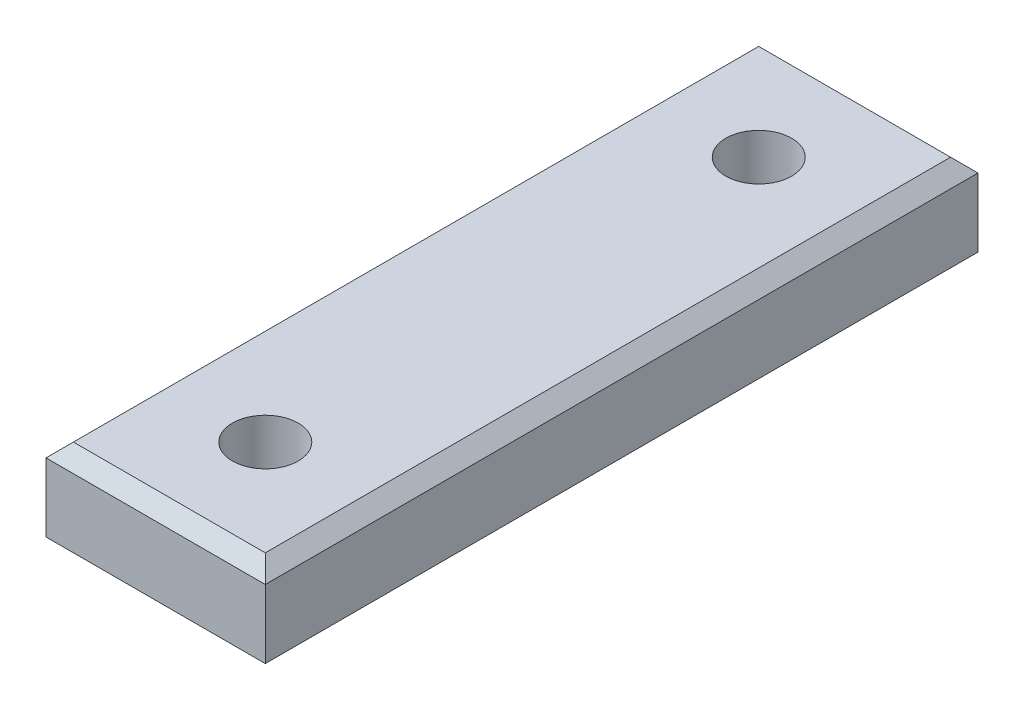
ISO-10303-21;
HEADER;
FILE_DESCRIPTION(('STEP AP214'),'2;1');
FILE_NAME('part.step','',(''),(''),'','','');
FILE_SCHEMA(('AUTOMOTIVE_DESIGN { 1 0 10303 214 1 1 1 1 }'));
ENDSEC;
DATA;
#1=APPLICATION_CONTEXT('core data for automotive mechanical design processes');
#2=APPLICATION_PROTOCOL_DEFINITION('international standard','automotive_design',2000,#1);
#3=PRODUCT_CONTEXT('',#1,'mechanical');
#4=PRODUCT('Part','Part','',(#3));
#5=PRODUCT_RELATED_PRODUCT_CATEGORY('part','',(#4));
#6=PRODUCT_DEFINITION_FORMATION('','',#4);
#7=PRODUCT_DEFINITION_CONTEXT('part definition',#1,'design');
#8=PRODUCT_DEFINITION('design','',#6,#7);
#9=PRODUCT_DEFINITION_SHAPE('','',#8);
#10=(LENGTH_UNIT() NAMED_UNIT(*) SI_UNIT(.MILLI.,.METRE.));
#11=(NAMED_UNIT(*) PLANE_ANGLE_UNIT() SI_UNIT($,.RADIAN.));
#12=(NAMED_UNIT(*) SI_UNIT($,.STERADIAN.) SOLID_ANGLE_UNIT());
#13=UNCERTAINTY_MEASURE_WITH_UNIT(LENGTH_MEASURE(1.E-05),#10,'distance_accuracy_value','');
#14=(GEOMETRIC_REPRESENTATION_CONTEXT(3) GLOBAL_UNCERTAINTY_ASSIGNED_CONTEXT((#13)) GLOBAL_UNIT_ASSIGNED_CONTEXT((#10,
#11,#12)) REPRESENTATION_CONTEXT('',''));
#15=CARTESIAN_POINT('',(0.,0.,0.));
#16=DIRECTION('',(0.,0.,1.));
#17=DIRECTION('',(1.,0.,0.));
#18=AXIS2_PLACEMENT_3D('',#15,#16,#17);
#19=CARTESIAN_POINT('',(4.,1.75,5.));
#20=DIRECTION('',(-1.,0.,0.));
#21=DIRECTION('',(0.,0.,1.));
#22=AXIS2_PLACEMENT_3D('',#19,#20,#21);
#23=PLANE('',#22);
#24=DIRECTION('',(0.,-1.,0.));
#25=VECTOR('',#24,1.);
#26=CARTESIAN_POINT('',(4.,1.75,-13.));
#27=LINE('',#26,#25);
#28=CARTESIAN_POINT('',(4.,1.25,-13.));
#29=VERTEX_POINT('',#28);
#30=CARTESIAN_POINT('',(4.,-1.25,-13.));
#31=VERTEX_POINT('',#30);
#32=EDGE_CURVE('E136',#29,#31,#27,.T.);
#33=ORIENTED_EDGE('',*,*,#32,.F.);
#34=DIRECTION('',(0.,0.,1.));
#35=VECTOR('',#34,1.);
#36=CARTESIAN_POINT('',(4.,1.25,5.));
#37=LINE('',#36,#35);
#38=CARTESIAN_POINT('',(4.,1.25,13.));
#39=VERTEX_POINT('',#38);
#40=EDGE_CURVE('E170',#29,#39,#37,.T.);
#41=ORIENTED_EDGE('',*,*,#40,.T.);
#42=DIRECTION('',(0.,-1.,0.));
#43=VECTOR('',#42,1.);
#44=CARTESIAN_POINT('',(4.,1.75,13.));
#45=LINE('',#44,#43);
#46=CARTESIAN_POINT('',(4.,-1.25,13.));
#47=VERTEX_POINT('',#46);
#48=EDGE_CURVE('E224',#39,#47,#45,.T.);
#49=ORIENTED_EDGE('',*,*,#48,.T.);
#50=DIRECTION('',(0.,0.,-1.));
#51=VECTOR('',#50,1.);
#52=CARTESIAN_POINT('',(4.,-1.25,5.));
#53=LINE('',#52,#51);
#54=EDGE_CURVE('E167',#47,#31,#53,.T.);
#55=ORIENTED_EDGE('',*,*,#54,.T.);
#56=EDGE_LOOP('',(#33,#41,#49,#55));
#57=FACE_BOUND('',#56,.T.);
#58=ADVANCED_FACE('F47',(#57),#23,.F.);
#59=CARTESIAN_POINT('',(-4.,1.75,5.));
#60=DIRECTION('',(0.,-1.,0.));
#61=DIRECTION('',(0.,0.,-1.));
#62=AXIS2_PLACEMENT_3D('',#59,#60,#61);
#63=PLANE('',#62);
#64=CARTESIAN_POINT('',(0.,1.75,9.));
#65=DIRECTION('',(0.,-1.,0.));
#66=DIRECTION('',(0.,0.,-1.));
#67=AXIS2_PLACEMENT_3D('',#64,#65,#66);
#68=CIRCLE('',#67,1.2);
#69=CARTESIAN_POINT('',(0.,1.75,10.2));
#70=VERTEX_POINT('',#69);
#71=EDGE_CURVE('E192',#70,#70,#68,.T.);
#72=ORIENTED_EDGE('',*,*,#71,.T.);
#73=EDGE_LOOP('',(#72));
#74=FACE_BOUND('',#73,.T.);
#75=CARTESIAN_POINT('',(0.,1.75,-9.));
#76=DIRECTION('',(0.,-1.,0.));
#77=DIRECTION('',(0.,0.,-1.));
#78=AXIS2_PLACEMENT_3D('',#75,#76,#77);
#79=CIRCLE('',#78,1.2);
#80=CARTESIAN_POINT('',(0.,1.75,-7.8));
#81=VERTEX_POINT('',#80);
#82=EDGE_CURVE('E247',#81,#81,#79,.T.);
#83=ORIENTED_EDGE('',*,*,#82,.T.);
#84=EDGE_LOOP('',(#83));
#85=FACE_BOUND('',#84,.T.);
#86=DIRECTION('',(0.,0.,1.));
#87=VECTOR('',#86,1.);
#88=CARTESIAN_POINT('',(-3.5,1.75,5.));
#89=LINE('',#88,#87);
#90=CARTESIAN_POINT('',(-3.5,1.75,-12.5));
#91=VERTEX_POINT('',#90);
#92=CARTESIAN_POINT('',(-3.5,1.75,12.5));
#93=VERTEX_POINT('',#92);
#94=EDGE_CURVE('E140',#91,#93,#89,.T.);
#95=ORIENTED_EDGE('',*,*,#94,.T.);
#96=DIRECTION('',(1.,0.,0.));
#97=VECTOR('',#96,1.);
#98=CARTESIAN_POINT('',(4.,1.75,12.5));
#99=LINE('',#98,#97);
#100=CARTESIAN_POINT('',(3.5,1.75,12.5));
#101=VERTEX_POINT('',#100);
#102=EDGE_CURVE('E119',#93,#101,#99,.T.);
#103=ORIENTED_EDGE('',*,*,#102,.T.);
#104=DIRECTION('',(0.,0.,-1.));
#105=VECTOR('',#104,1.);
#106=CARTESIAN_POINT('',(3.5,1.75,5.));
#107=LINE('',#106,#105);
#108=CARTESIAN_POINT('',(3.5,1.75,-12.5));
#109=VERTEX_POINT('',#108);
#110=EDGE_CURVE('E128',#101,#109,#107,.T.);
#111=ORIENTED_EDGE('',*,*,#110,.T.);
#112=DIRECTION('',(-1.,0.,0.));
#113=VECTOR('',#112,1.);
#114=CARTESIAN_POINT('',(-4.,1.75,-12.5));
#115=LINE('',#114,#113);
#116=EDGE_CURVE('E135',#109,#91,#115,.T.);
#117=ORIENTED_EDGE('',*,*,#116,.T.);
#118=EDGE_LOOP('',(#95,#103,#111,#117));
#119=FACE_BOUND('',#118,.T.);
#120=ADVANCED_FACE('F138',(#74,#85,#119),#63,.F.);
#121=CARTESIAN_POINT('',(-4.,1.75,5.));
#122=DIRECTION('',(1.,0.,0.));
#123=DIRECTION('',(0.,0.,-1.));
#124=AXIS2_PLACEMENT_3D('',#121,#122,#123);
#125=PLANE('',#124);
#126=DIRECTION('',(0.,1.,0.));
#127=VECTOR('',#126,1.);
#128=CARTESIAN_POINT('',(-4.,1.75,13.));
#129=LINE('',#128,#127);
#130=CARTESIAN_POINT('',(-4.,-1.25,13.));
#131=VERTEX_POINT('',#130);
#132=CARTESIAN_POINT('',(-4.,1.25,13.));
#133=VERTEX_POINT('',#132);
#134=EDGE_CURVE('E187',#131,#133,#129,.T.);
#135=ORIENTED_EDGE('',*,*,#134,.T.);
#136=DIRECTION('',(0.,0.,-1.));
#137=VECTOR('',#136,1.);
#138=CARTESIAN_POINT('',(-4.,1.25,5.));
#139=LINE('',#138,#137);
#140=CARTESIAN_POINT('',(-4.,1.25,-13.));
#141=VERTEX_POINT('',#140);
#142=EDGE_CURVE('E159',#133,#141,#139,.T.);
#143=ORIENTED_EDGE('',*,*,#142,.T.);
#144=DIRECTION('',(0.,1.,0.));
#145=VECTOR('',#144,1.);
#146=CARTESIAN_POINT('',(-4.,1.75,-13.));
#147=LINE('',#146,#145);
#148=CARTESIAN_POINT('',(-4.,-1.25,-13.));
#149=VERTEX_POINT('',#148);
#150=EDGE_CURVE('E215',#149,#141,#147,.T.);
#151=ORIENTED_EDGE('',*,*,#150,.F.);
#152=DIRECTION('',(0.,0.,1.));
#153=VECTOR('',#152,1.);
#154=CARTESIAN_POINT('',(-4.,-1.25,5.));
#155=LINE('',#154,#153);
#156=EDGE_CURVE('E156',#149,#131,#155,.T.);
#157=ORIENTED_EDGE('',*,*,#156,.T.);
#158=EDGE_LOOP('',(#135,#143,#151,#157));
#159=FACE_BOUND('',#158,.T.);
#160=ADVANCED_FACE('F220',(#159),#125,.F.);
#161=CARTESIAN_POINT('',(-4.,-1.75,5.));
#162=DIRECTION('',(0.,1.,0.));
#163=DIRECTION('',(0.,0.,1.));
#164=AXIS2_PLACEMENT_3D('',#161,#162,#163);
#165=PLANE('',#164);
#166=CARTESIAN_POINT('',(0.,-1.75,9.));
#167=DIRECTION('',(0.,1.,0.));
#168=DIRECTION('',(0.,0.,1.));
#169=AXIS2_PLACEMENT_3D('',#166,#167,#168);
#170=CIRCLE('',#169,1.2);
#171=CARTESIAN_POINT('',(0.,-1.75,10.2));
#172=VERTEX_POINT('',#171);
#173=EDGE_CURVE('E250',#172,#172,#170,.T.);
#174=ORIENTED_EDGE('',*,*,#173,.T.);
#175=EDGE_LOOP('',(#174));
#176=FACE_BOUND('',#175,.T.);
#177=CARTESIAN_POINT('',(0.,-1.75,-9.));
#178=DIRECTION('',(0.,1.,0.));
#179=DIRECTION('',(0.,0.,1.));
#180=AXIS2_PLACEMENT_3D('',#177,#178,#179);
#181=CIRCLE('',#180,1.2);
#182=CARTESIAN_POINT('',(0.,-1.75,-7.8));
#183=VERTEX_POINT('',#182);
#184=EDGE_CURVE('E251',#183,#183,#181,.T.);
#185=ORIENTED_EDGE('',*,*,#184,.T.);
#186=EDGE_LOOP('',(#185));
#187=FACE_BOUND('',#186,.T.);
#188=DIRECTION('',(0.,0.,1.));
#189=VECTOR('',#188,1.);
#190=CARTESIAN_POINT('',(3.5,-1.75,5.));
#191=LINE('',#190,#189);
#192=CARTESIAN_POINT('',(3.5,-1.75,-12.5));
#193=VERTEX_POINT('',#192);
#194=CARTESIAN_POINT('',(3.5,-1.75,12.5));
#195=VERTEX_POINT('',#194);
#196=EDGE_CURVE('E58',#193,#195,#191,.T.);
#197=ORIENTED_EDGE('',*,*,#196,.T.);
#198=DIRECTION('',(-1.,0.,0.));
#199=VECTOR('',#198,1.);
#200=CARTESIAN_POINT('',(-4.,-1.75,12.5));
#201=LINE('',#200,#199);
#202=CARTESIAN_POINT('',(-3.5,-1.75,12.5));
#203=VERTEX_POINT('',#202);
#204=EDGE_CURVE('E11',#195,#203,#201,.T.);
#205=ORIENTED_EDGE('',*,*,#204,.T.);
#206=DIRECTION('',(0.,0.,-1.));
#207=VECTOR('',#206,1.);
#208=CARTESIAN_POINT('',(-3.5,-1.75,5.));
#209=LINE('',#208,#207);
#210=CARTESIAN_POINT('',(-3.5,-1.75,-12.5));
#211=VERTEX_POINT('',#210);
#212=EDGE_CURVE('E172',#203,#211,#209,.T.);
#213=ORIENTED_EDGE('',*,*,#212,.T.);
#214=DIRECTION('',(1.,0.,0.));
#215=VECTOR('',#214,1.);
#216=CARTESIAN_POINT('',(4.,-1.75,-12.5));
#217=LINE('',#216,#215);
#218=EDGE_CURVE('E69',#211,#193,#217,.T.);
#219=ORIENTED_EDGE('',*,*,#218,.T.);
#220=EDGE_LOOP('',(#197,#205,#213,#219));
#221=FACE_BOUND('',#220,.T.);
#222=ADVANCED_FACE('F258',(#176,#187,#221),#165,.F.);
#223=CARTESIAN_POINT('',(0.,0.,-13.));
#224=DIRECTION('',(0.,0.,-1.));
#225=DIRECTION('',(-1.,0.,0.));
#226=AXIS2_PLACEMENT_3D('',#223,#224,#225);
#227=PLANE('',#226);
#228=ORIENTED_EDGE('',*,*,#150,.T.);
#229=DIRECTION('',(1.,0.,0.));
#230=VECTOR('',#229,1.);
#231=CARTESIAN_POINT('',(4.,1.25,-13.));
#232=LINE('',#231,#230);
#233=EDGE_CURVE('E165',#141,#29,#232,.T.);
#234=ORIENTED_EDGE('',*,*,#233,.T.);
#235=ORIENTED_EDGE('',*,*,#32,.T.);
#236=DIRECTION('',(-1.,0.,0.));
#237=VECTOR('',#236,1.);
#238=CARTESIAN_POINT('',(-4.,-1.25,-13.));
#239=LINE('',#238,#237);
#240=EDGE_CURVE('E162',#31,#149,#239,.T.);
#241=ORIENTED_EDGE('',*,*,#240,.T.);
#242=EDGE_LOOP('',(#228,#234,#235,#241));
#243=FACE_BOUND('',#242,.T.);
#244=ADVANCED_FACE('F214',(#243),#227,.T.);
#245=CARTESIAN_POINT('',(0.,0.,13.));
#246=DIRECTION('',(0.,0.,1.));
#247=DIRECTION('',(-1.,0.,0.));
#248=AXIS2_PLACEMENT_3D('',#245,#246,#247);
#249=PLANE('',#248);
#250=ORIENTED_EDGE('',*,*,#48,.F.);
#251=DIRECTION('',(-1.,0.,0.));
#252=VECTOR('',#251,1.);
#253=CARTESIAN_POINT('',(-4.,1.25,13.));
#254=LINE('',#253,#252);
#255=EDGE_CURVE('E121',#39,#133,#254,.T.);
#256=ORIENTED_EDGE('',*,*,#255,.T.);
#257=ORIENTED_EDGE('',*,*,#134,.F.);
#258=DIRECTION('',(1.,0.,0.));
#259=VECTOR('',#258,1.);
#260=CARTESIAN_POINT('',(4.,-1.25,13.));
#261=LINE('',#260,#259);
#262=EDGE_CURVE('E143',#131,#47,#261,.T.);
#263=ORIENTED_EDGE('',*,*,#262,.T.);
#264=EDGE_LOOP('',(#250,#256,#257,#263));
#265=FACE_BOUND('',#264,.T.);
#266=ADVANCED_FACE('F241',(#265),#249,.T.);
#267=CARTESIAN_POINT('',(0.,1.25,-13.));
#268=DIRECTION('',(0.,0.707106781186547,-0.707106781186547));
#269=DIRECTION('',(-1.,0.,0.));
#270=AXIS2_PLACEMENT_3D('',#267,#268,#269);
#271=PLANE('',#270);
#272=DIRECTION('',(0.577350269189626,-0.577350269189626,-0.577350269189626));
#273=VECTOR('',#272,1.);
#274=CARTESIAN_POINT('',(-2.33333333333333,7.58333333333333,-6.66666666666667));
#275=LINE('',#274,#273);
#276=EDGE_CURVE('E131',#29,#109,#275,.F.);
#277=ORIENTED_EDGE('',*,*,#276,.F.);
#278=ORIENTED_EDGE('',*,*,#233,.F.);
#279=DIRECTION('',(-0.577350269189626,-0.577350269189626,-0.577350269189626));
#280=VECTOR('',#279,1.);
#281=CARTESIAN_POINT('',(-2.66666666666667,2.58333333333334,-11.6666666666667));
#282=LINE('',#281,#280);
#283=EDGE_CURVE('E183',#91,#141,#282,.T.);
#284=ORIENTED_EDGE('',*,*,#283,.F.);
#285=ORIENTED_EDGE('',*,*,#116,.F.);
#286=EDGE_LOOP('',(#277,#278,#284,#285));
#287=FACE_BOUND('',#286,.T.);
#288=ADVANCED_FACE('F236',(#287),#271,.T.);
#289=CARTESIAN_POINT('',(-4.,1.25,5.));
#290=DIRECTION('',(0.707106781186547,-0.707106781186547,0.));
#291=DIRECTION('',(0.,0.,-1.));
#292=AXIS2_PLACEMENT_3D('',#289,#290,#291);
#293=PLANE('',#292);
#294=ORIENTED_EDGE('',*,*,#283,.T.);
#295=ORIENTED_EDGE('',*,*,#142,.F.);
#296=DIRECTION('',(-0.577350269189626,-0.577350269189626,0.577350269189626));
#297=VECTOR('',#296,1.);
#298=CARTESIAN_POINT('',(-1.33333333333333,3.91666666666667,10.3333333333333));
#299=LINE('',#298,#297);
#300=EDGE_CURVE('E125',#93,#133,#299,.T.);
#301=ORIENTED_EDGE('',*,*,#300,.F.);
#302=ORIENTED_EDGE('',*,*,#94,.F.);
#303=EDGE_LOOP('',(#294,#295,#301,#302));
#304=FACE_BOUND('',#303,.T.);
#305=ADVANCED_FACE('F238',(#304),#293,.F.);
#306=CARTESIAN_POINT('',(3.5,1.75,5.));
#307=DIRECTION('',(-0.707106781186547,-0.707106781186547,0.));
#308=DIRECTION('',(0.,0.,-1.));
#309=AXIS2_PLACEMENT_3D('',#306,#307,#308);
#310=PLANE('',#309);
#311=ORIENTED_EDGE('',*,*,#276,.T.);
#312=ORIENTED_EDGE('',*,*,#110,.F.);
#313=DIRECTION('',(-0.577350269189626,0.577350269189626,-0.577350269189626));
#314=VECTOR('',#313,1.);
#315=CARTESIAN_POINT('',(1.,4.25,10.));
#316=LINE('',#315,#314);
#317=EDGE_CURVE('E115',#39,#101,#316,.T.);
#318=ORIENTED_EDGE('',*,*,#317,.F.);
#319=ORIENTED_EDGE('',*,*,#40,.F.);
#320=EDGE_LOOP('',(#311,#312,#318,#319));
#321=FACE_BOUND('',#320,.T.);
#322=ADVANCED_FACE('F129',(#321),#310,.F.);
#323=CARTESIAN_POINT('',(-4.,1.75,12.5));
#324=DIRECTION('',(0.,0.707106781186547,0.707106781186547));
#325=DIRECTION('',(-1.,0.,0.));
#326=AXIS2_PLACEMENT_3D('',#323,#324,#325);
#327=PLANE('',#326);
#328=ORIENTED_EDGE('',*,*,#300,.T.);
#329=ORIENTED_EDGE('',*,*,#255,.F.);
#330=ORIENTED_EDGE('',*,*,#317,.T.);
#331=ORIENTED_EDGE('',*,*,#102,.F.);
#332=EDGE_LOOP('',(#328,#329,#330,#331));
#333=FACE_BOUND('',#332,.T.);
#334=ADVANCED_FACE('F117',(#333),#327,.T.);
#335=CARTESIAN_POINT('',(0.,-1.25,-13.));
#336=DIRECTION('',(0.,-0.707106781186547,-0.707106781186547));
#337=DIRECTION('',(1.,0.,0.));
#338=AXIS2_PLACEMENT_3D('',#335,#336,#337);
#339=PLANE('',#338);
#340=DIRECTION('',(-0.577350269189626,0.577350269189626,-0.577350269189626));
#341=VECTOR('',#340,1.);
#342=CARTESIAN_POINT('',(2.33333333333333,-7.58333333333333,-6.66666666666667));
#343=LINE('',#342,#341);
#344=EDGE_CURVE('E194',#149,#211,#343,.F.);
#345=ORIENTED_EDGE('',*,*,#344,.F.);
#346=ORIENTED_EDGE('',*,*,#240,.F.);
#347=DIRECTION('',(0.577350269189626,0.577350269189626,-0.577350269189626));
#348=VECTOR('',#347,1.);
#349=CARTESIAN_POINT('',(2.66666666666667,-2.58333333333334,-11.6666666666667));
#350=LINE('',#349,#348);
#351=EDGE_CURVE('E52',#193,#31,#350,.T.);
#352=ORIENTED_EDGE('',*,*,#351,.F.);
#353=ORIENTED_EDGE('',*,*,#218,.F.);
#354=EDGE_LOOP('',(#345,#346,#352,#353));
#355=FACE_BOUND('',#354,.T.);
#356=ADVANCED_FACE('F50',(#355),#339,.T.);
#357=CARTESIAN_POINT('',(4.,-1.25,5.));
#358=DIRECTION('',(-0.707106781186547,0.707106781186547,0.));
#359=DIRECTION('',(0.,0.,-1.));
#360=AXIS2_PLACEMENT_3D('',#357,#358,#359);
#361=PLANE('',#360);
#362=ORIENTED_EDGE('',*,*,#351,.T.);
#363=ORIENTED_EDGE('',*,*,#54,.F.);
#364=DIRECTION('',(0.577350269189626,0.577350269189626,0.577350269189626));
#365=VECTOR('',#364,1.);
#366=CARTESIAN_POINT('',(1.33333333333333,-3.91666666666667,10.3333333333333));
#367=LINE('',#366,#365);
#368=EDGE_CURVE('E191',#195,#47,#367,.T.);
#369=ORIENTED_EDGE('',*,*,#368,.F.);
#370=ORIENTED_EDGE('',*,*,#196,.F.);
#371=EDGE_LOOP('',(#362,#363,#369,#370));
#372=FACE_BOUND('',#371,.T.);
#373=ADVANCED_FACE('F207',(#372),#361,.F.);
#374=CARTESIAN_POINT('',(-3.5,-1.75,5.));
#375=DIRECTION('',(0.707106781186547,0.707106781186547,0.));
#376=DIRECTION('',(0.,0.,-1.));
#377=AXIS2_PLACEMENT_3D('',#374,#375,#376);
#378=PLANE('',#377);
#379=ORIENTED_EDGE('',*,*,#344,.T.);
#380=ORIENTED_EDGE('',*,*,#212,.F.);
#381=DIRECTION('',(0.577350269189626,-0.577350269189626,-0.577350269189626));
#382=VECTOR('',#381,1.);
#383=CARTESIAN_POINT('',(-1.,-4.25,10.));
#384=LINE('',#383,#382);
#385=EDGE_CURVE('E188',#131,#203,#384,.T.);
#386=ORIENTED_EDGE('',*,*,#385,.F.);
#387=ORIENTED_EDGE('',*,*,#156,.F.);
#388=EDGE_LOOP('',(#379,#380,#386,#387));
#389=FACE_BOUND('',#388,.T.);
#390=ADVANCED_FACE('F279',(#389),#378,.F.);
#391=CARTESIAN_POINT('',(-4.,-1.75,12.5));
#392=DIRECTION('',(0.,-0.707106781186547,0.707106781186547));
#393=DIRECTION('',(1.,0.,0.));
#394=AXIS2_PLACEMENT_3D('',#391,#392,#393);
#395=PLANE('',#394);
#396=ORIENTED_EDGE('',*,*,#368,.T.);
#397=ORIENTED_EDGE('',*,*,#262,.F.);
#398=ORIENTED_EDGE('',*,*,#385,.T.);
#399=ORIENTED_EDGE('',*,*,#204,.F.);
#400=EDGE_LOOP('',(#396,#397,#398,#399));
#401=FACE_BOUND('',#400,.T.);
#402=ADVANCED_FACE('F274',(#401),#395,.T.);
#403=CARTESIAN_POINT('',(0.,-1.75,-9.));
#404=DIRECTION('',(0.,1.,0.));
#405=DIRECTION('',(0.,0.,1.));
#406=AXIS2_PLACEMENT_3D('',#403,#404,#405);
#407=CYLINDRICAL_SURFACE('',#406,1.2);
#408=CARTESIAN_POINT('',(0.,-1.75,-7.8));
#409=CARTESIAN_POINT('',(0.,-1.71354166666667,-7.8));
#410=CARTESIAN_POINT('',(0.,-1.67708333333333,-7.8));
#411=CARTESIAN_POINT('',(0.,-1.60416666666667,-7.8));
#412=CARTESIAN_POINT('',(0.,-1.56770833333333,-7.8));
#413=CARTESIAN_POINT('',(0.,-1.49479166666667,-7.8));
#414=CARTESIAN_POINT('',(0.,-1.45833333333333,-7.8));
#415=CARTESIAN_POINT('',(0.,-1.38541666666667,-7.8));
#416=CARTESIAN_POINT('',(0.,-1.34895833333333,-7.8));
#417=CARTESIAN_POINT('',(0.,-1.27604166666667,-7.8));
#418=CARTESIAN_POINT('',(0.,-1.23958333333333,-7.8));
#419=CARTESIAN_POINT('',(0.,-1.16666666666667,-7.8));
#420=CARTESIAN_POINT('',(0.,-1.13020833333333,-7.8));
#421=CARTESIAN_POINT('',(0.,-1.05729166666667,-7.8));
#422=CARTESIAN_POINT('',(0.,-1.02083333333333,-7.8));
#423=CARTESIAN_POINT('',(0.,-0.947916666666667,-7.8));
#424=CARTESIAN_POINT('',(0.,-0.911458333333333,-7.8));
#425=CARTESIAN_POINT('',(0.,-0.838541666666667,-7.8));
#426=CARTESIAN_POINT('',(0.,-0.802083333333333,-7.8));
#427=CARTESIAN_POINT('',(0.,-0.729166666666667,-7.8));
#428=CARTESIAN_POINT('',(0.,-0.692708333333333,-7.8));
#429=CARTESIAN_POINT('',(0.,-0.619791666666667,-7.8));
#430=CARTESIAN_POINT('',(0.,-0.583333333333333,-7.8));
#431=CARTESIAN_POINT('',(0.,-0.510416666666667,-7.8));
#432=CARTESIAN_POINT('',(0.,-0.473958333333333,-7.8));
#433=CARTESIAN_POINT('',(0.,-0.401041666666667,-7.8));
#434=CARTESIAN_POINT('',(0.,-0.364583333333333,-7.8));
#435=CARTESIAN_POINT('',(0.,-0.291666666666667,-7.8));
#436=CARTESIAN_POINT('',(0.,-0.255208333333333,-7.8));
#437=CARTESIAN_POINT('',(0.,-0.182291666666667,-7.8));
#438=CARTESIAN_POINT('',(0.,-0.145833333333333,-7.8));
#439=CARTESIAN_POINT('',(0.,-0.0729166666666667,-7.8));
#440=CARTESIAN_POINT('',(0.,-0.0364583333333333,-7.8));
#441=CARTESIAN_POINT('',(0.,0.0364583333333333,-7.8));
#442=CARTESIAN_POINT('',(0.,0.0729166666666667,-7.8));
#443=CARTESIAN_POINT('',(0.,0.145833333333333,-7.8));
#444=CARTESIAN_POINT('',(0.,0.182291666666667,-7.8));
#445=CARTESIAN_POINT('',(0.,0.255208333333333,-7.8));
#446=CARTESIAN_POINT('',(0.,0.291666666666667,-7.8));
#447=CARTESIAN_POINT('',(0.,0.364583333333333,-7.8));
#448=CARTESIAN_POINT('',(0.,0.401041666666667,-7.8));
#449=CARTESIAN_POINT('',(0.,0.473958333333333,-7.8));
#450=CARTESIAN_POINT('',(0.,0.510416666666667,-7.8));
#451=CARTESIAN_POINT('',(0.,0.583333333333333,-7.8));
#452=CARTESIAN_POINT('',(0.,0.619791666666667,-7.8));
#453=CARTESIAN_POINT('',(0.,0.692708333333333,-7.8));
#454=CARTESIAN_POINT('',(0.,0.729166666666667,-7.8));
#455=CARTESIAN_POINT('',(0.,0.802083333333334,-7.8));
#456=CARTESIAN_POINT('',(0.,0.838541666666667,-7.8));
#457=CARTESIAN_POINT('',(0.,0.911458333333334,-7.8));
#458=CARTESIAN_POINT('',(0.,0.947916666666667,-7.8));
#459=CARTESIAN_POINT('',(0.,1.02083333333333,-7.8));
#460=CARTESIAN_POINT('',(0.,1.05729166666667,-7.8));
#461=CARTESIAN_POINT('',(0.,1.13020833333333,-7.8));
#462=CARTESIAN_POINT('',(0.,1.16666666666667,-7.8));
#463=CARTESIAN_POINT('',(0.,1.23958333333333,-7.8));
#464=CARTESIAN_POINT('',(0.,1.27604166666667,-7.8));
#465=CARTESIAN_POINT('',(0.,1.34895833333333,-7.8));
#466=CARTESIAN_POINT('',(0.,1.38541666666667,-7.8));
#467=CARTESIAN_POINT('',(0.,1.45833333333333,-7.8));
#468=CARTESIAN_POINT('',(0.,1.49479166666667,-7.8));
#469=CARTESIAN_POINT('',(0.,1.56770833333333,-7.8));
#470=CARTESIAN_POINT('',(0.,1.60416666666667,-7.8));
#471=CARTESIAN_POINT('',(0.,1.67708333333333,-7.8));
#472=CARTESIAN_POINT('',(0.,1.71354166666667,-7.8));
#473=CARTESIAN_POINT('',(0.,1.75,-7.8));
#474=B_SPLINE_CURVE_WITH_KNOTS('',3,(#408,#409,#410,#411,#412,#413,#414,#415,#416,#417,#418,
#419,#420,#421,#422,#423,#424,#425,#426,#427,#428,#429,#430,#431,#432,#433,#434,#435,#436,#437,
#438,#439,#440,#441,#442,#443,#444,#445,#446,#447,#448,#449,#450,#451,#452,#453,#454,#455,#456,
#457,#458,#459,#460,#461,#462,#463,#464,#465,#466,#467,#468,#469,#470,#471,#472,#473),
.UNSPECIFIED.,.F.,.F.,(4,2,2,2,2,2,2,2,2,2,2,2,2,2,2,2,2,2,2,2,2,2,2,2,2,2,2,2,2,2,2,2,4),(0.,
0.109375,0.21875,0.328125,0.4375,0.546875,0.65625,0.765625,0.875,0.984375,1.09375,1.203125,
1.3125,1.421875,1.53125,1.640625,1.75,1.859375,1.96875,2.078125,2.1875,2.296875,2.40625,
2.515625,2.625,2.734375,2.84375,2.953125,3.0625,3.171875,3.28125,3.390625,3.5),.UNSPECIFIED.);
#475=EDGE_CURVE('BSEAM264',#183,#81,#474,.T.);
#476=ORIENTED_EDGE('',*,*,#184,.F.);
#477=ORIENTED_EDGE('',*,*,#82,.F.);
#478=ORIENTED_EDGE('',*,*,#475,.T.);
#479=ORIENTED_EDGE('',*,*,#475,.F.);
#480=EDGE_LOOP('',(#476,#478,#477,#479));
#481=FACE_BOUND('',#480,.T.);
#482=ADVANCED_FACE('F264',(#481),#407,.F.);
#483=CARTESIAN_POINT('',(0.,-1.75,9.));
#484=DIRECTION('',(0.,1.,0.));
#485=DIRECTION('',(0.,0.,1.));
#486=AXIS2_PLACEMENT_3D('',#483,#484,#485);
#487=CYLINDRICAL_SURFACE('',#486,1.2);
#488=CARTESIAN_POINT('',(0.,-1.75,10.2));
#489=CARTESIAN_POINT('',(0.,-1.71354166666667,10.2));
#490=CARTESIAN_POINT('',(0.,-1.67708333333333,10.2));
#491=CARTESIAN_POINT('',(0.,-1.60416666666667,10.2));
#492=CARTESIAN_POINT('',(0.,-1.56770833333333,10.2));
#493=CARTESIAN_POINT('',(0.,-1.49479166666667,10.2));
#494=CARTESIAN_POINT('',(0.,-1.45833333333333,10.2));
#495=CARTESIAN_POINT('',(0.,-1.38541666666667,10.2));
#496=CARTESIAN_POINT('',(0.,-1.34895833333333,10.2));
#497=CARTESIAN_POINT('',(0.,-1.27604166666667,10.2));
#498=CARTESIAN_POINT('',(0.,-1.23958333333333,10.2));
#499=CARTESIAN_POINT('',(0.,-1.16666666666667,10.2));
#500=CARTESIAN_POINT('',(0.,-1.13020833333333,10.2));
#501=CARTESIAN_POINT('',(0.,-1.05729166666667,10.2));
#502=CARTESIAN_POINT('',(0.,-1.02083333333333,10.2));
#503=CARTESIAN_POINT('',(0.,-0.947916666666667,10.2));
#504=CARTESIAN_POINT('',(0.,-0.911458333333333,10.2));
#505=CARTESIAN_POINT('',(0.,-0.838541666666667,10.2));
#506=CARTESIAN_POINT('',(0.,-0.802083333333333,10.2));
#507=CARTESIAN_POINT('',(0.,-0.729166666666667,10.2));
#508=CARTESIAN_POINT('',(0.,-0.692708333333333,10.2));
#509=CARTESIAN_POINT('',(0.,-0.619791666666667,10.2));
#510=CARTESIAN_POINT('',(0.,-0.583333333333333,10.2));
#511=CARTESIAN_POINT('',(0.,-0.510416666666667,10.2));
#512=CARTESIAN_POINT('',(0.,-0.473958333333333,10.2));
#513=CARTESIAN_POINT('',(0.,-0.401041666666667,10.2));
#514=CARTESIAN_POINT('',(0.,-0.364583333333333,10.2));
#515=CARTESIAN_POINT('',(0.,-0.291666666666667,10.2));
#516=CARTESIAN_POINT('',(0.,-0.255208333333333,10.2));
#517=CARTESIAN_POINT('',(0.,-0.182291666666667,10.2));
#518=CARTESIAN_POINT('',(0.,-0.145833333333333,10.2));
#519=CARTESIAN_POINT('',(0.,-0.0729166666666667,10.2));
#520=CARTESIAN_POINT('',(0.,-0.0364583333333333,10.2));
#521=CARTESIAN_POINT('',(0.,0.0364583333333333,10.2));
#522=CARTESIAN_POINT('',(0.,0.0729166666666667,10.2));
#523=CARTESIAN_POINT('',(0.,0.145833333333333,10.2));
#524=CARTESIAN_POINT('',(0.,0.182291666666667,10.2));
#525=CARTESIAN_POINT('',(0.,0.255208333333333,10.2));
#526=CARTESIAN_POINT('',(0.,0.291666666666667,10.2));
#527=CARTESIAN_POINT('',(0.,0.364583333333333,10.2));
#528=CARTESIAN_POINT('',(0.,0.401041666666667,10.2));
#529=CARTESIAN_POINT('',(0.,0.473958333333333,10.2));
#530=CARTESIAN_POINT('',(0.,0.510416666666667,10.2));
#531=CARTESIAN_POINT('',(0.,0.583333333333333,10.2));
#532=CARTESIAN_POINT('',(0.,0.619791666666667,10.2));
#533=CARTESIAN_POINT('',(0.,0.692708333333333,10.2));
#534=CARTESIAN_POINT('',(0.,0.729166666666667,10.2));
#535=CARTESIAN_POINT('',(0.,0.802083333333334,10.2));
#536=CARTESIAN_POINT('',(0.,0.838541666666667,10.2));
#537=CARTESIAN_POINT('',(0.,0.911458333333334,10.2));
#538=CARTESIAN_POINT('',(0.,0.947916666666667,10.2));
#539=CARTESIAN_POINT('',(0.,1.02083333333333,10.2));
#540=CARTESIAN_POINT('',(0.,1.05729166666667,10.2));
#541=CARTESIAN_POINT('',(0.,1.13020833333333,10.2));
#542=CARTESIAN_POINT('',(0.,1.16666666666667,10.2));
#543=CARTESIAN_POINT('',(0.,1.23958333333333,10.2));
#544=CARTESIAN_POINT('',(0.,1.27604166666667,10.2));
#545=CARTESIAN_POINT('',(0.,1.34895833333333,10.2));
#546=CARTESIAN_POINT('',(0.,1.38541666666667,10.2));
#547=CARTESIAN_POINT('',(0.,1.45833333333333,10.2));
#548=CARTESIAN_POINT('',(0.,1.49479166666667,10.2));
#549=CARTESIAN_POINT('',(0.,1.56770833333333,10.2));
#550=CARTESIAN_POINT('',(0.,1.60416666666667,10.2));
#551=CARTESIAN_POINT('',(0.,1.67708333333333,10.2));
#552=CARTESIAN_POINT('',(0.,1.71354166666667,10.2));
#553=CARTESIAN_POINT('',(0.,1.75,10.2));
#554=B_SPLINE_CURVE_WITH_KNOTS('',3,(#488,#489,#490,#491,#492,#493,#494,#495,#496,#497,#498,
#499,#500,#501,#502,#503,#504,#505,#506,#507,#508,#509,#510,#511,#512,#513,#514,#515,#516,#517,
#518,#519,#520,#521,#522,#523,#524,#525,#526,#527,#528,#529,#530,#531,#532,#533,#534,#535,#536,
#537,#538,#539,#540,#541,#542,#543,#544,#545,#546,#547,#548,#549,#550,#551,#552,#553),
.UNSPECIFIED.,.F.,.F.,(4,2,2,2,2,2,2,2,2,2,2,2,2,2,2,2,2,2,2,2,2,2,2,2,2,2,2,2,2,2,2,2,4),(0.,
0.109375,0.21875,0.328125,0.4375,0.546875,0.65625,0.765625,0.875,0.984375,1.09375,1.203125,
1.3125,1.421875,1.53125,1.640625,1.75,1.859375,1.96875,2.078125,2.1875,2.296875,2.40625,
2.515625,2.625,2.734375,2.84375,2.953125,3.0625,3.171875,3.28125,3.390625,3.5),.UNSPECIFIED.);
#555=EDGE_CURVE('BSEAM261',#172,#70,#554,.T.);
#556=ORIENTED_EDGE('',*,*,#173,.F.);
#557=ORIENTED_EDGE('',*,*,#71,.F.);
#558=ORIENTED_EDGE('',*,*,#555,.T.);
#559=ORIENTED_EDGE('',*,*,#555,.F.);
#560=EDGE_LOOP('',(#556,#558,#557,#559));
#561=FACE_BOUND('',#560,.T.);
#562=ADVANCED_FACE('F261',(#561),#487,.F.);
#563=CLOSED_SHELL('',(#58,#120,#160,#222,#244,#266,#288,#305,#322,#334,#356,#373,#390,#402,#482,#562));
#564=MANIFOLD_SOLID_BREP('B2',#563);
#565=ADVANCED_BREP_SHAPE_REPRESENTATION('',(#18,#564),#14);
#566=SHAPE_DEFINITION_REPRESENTATION(#9,#565);
ENDSEC;
END-ISO-10303-21;
